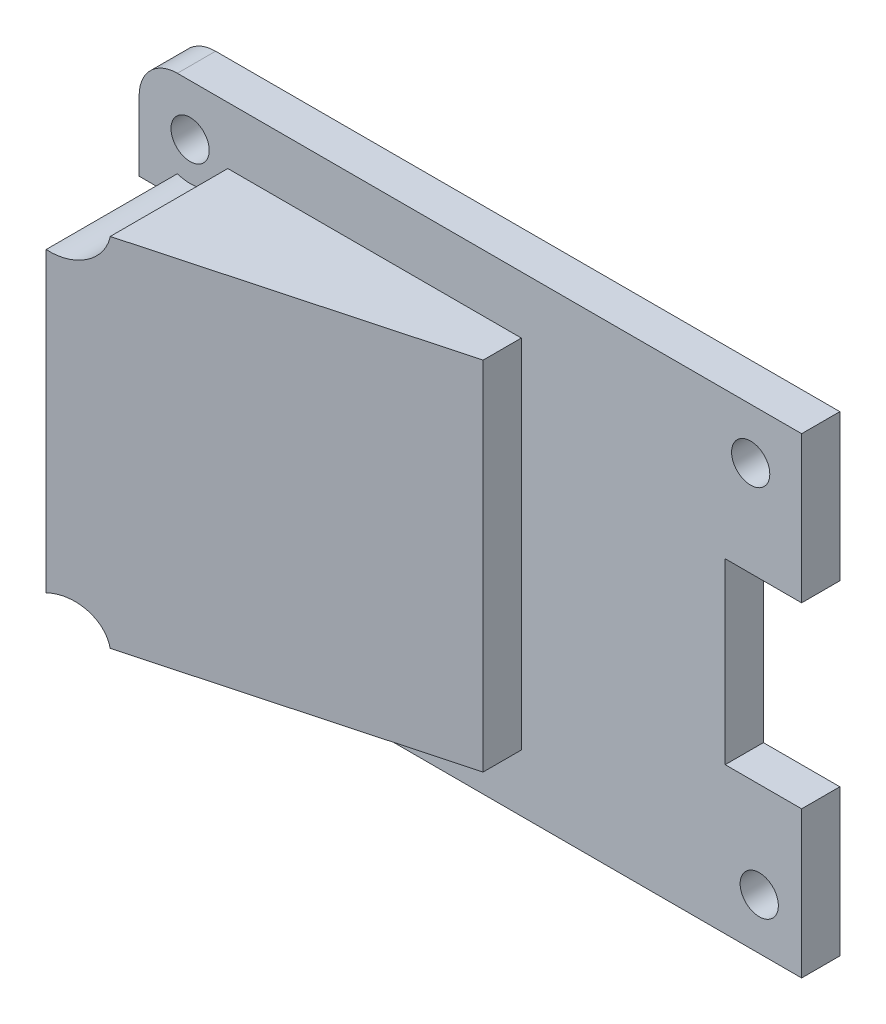
ISO-10303-21;
HEADER;
FILE_DESCRIPTION(('STEP AP214'),'2;1');
FILE_NAME('part.step','',(''),(''),'','','');
FILE_SCHEMA(('AUTOMOTIVE_DESIGN { 1 0 10303 214 1 1 1 1 }'));
ENDSEC;
DATA;
#1=APPLICATION_CONTEXT('core data for automotive mechanical design processes');
#2=APPLICATION_PROTOCOL_DEFINITION('international standard','automotive_design',2000,#1);
#3=PRODUCT_CONTEXT('',#1,'mechanical');
#4=PRODUCT('Part','Part','',(#3));
#5=PRODUCT_RELATED_PRODUCT_CATEGORY('part','',(#4));
#6=PRODUCT_DEFINITION_FORMATION('','',#4);
#7=PRODUCT_DEFINITION_CONTEXT('part definition',#1,'design');
#8=PRODUCT_DEFINITION('design','',#6,#7);
#9=PRODUCT_DEFINITION_SHAPE('','',#8);
#10=(LENGTH_UNIT() NAMED_UNIT(*) SI_UNIT(.MILLI.,.METRE.));
#11=(NAMED_UNIT(*) PLANE_ANGLE_UNIT() SI_UNIT($,.RADIAN.));
#12=(NAMED_UNIT(*) SI_UNIT($,.STERADIAN.) SOLID_ANGLE_UNIT());
#13=UNCERTAINTY_MEASURE_WITH_UNIT(LENGTH_MEASURE(1.E-05),#10,'distance_accuracy_value','');
#14=(GEOMETRIC_REPRESENTATION_CONTEXT(3) GLOBAL_UNCERTAINTY_ASSIGNED_CONTEXT((#13)) GLOBAL_UNIT_ASSIGNED_CONTEXT((#10,
#11,#12)) REPRESENTATION_CONTEXT('',''));
#15=CARTESIAN_POINT('',(0.,0.,0.));
#16=DIRECTION('',(0.,0.,1.));
#17=DIRECTION('',(1.,0.,0.));
#18=AXIS2_PLACEMENT_3D('',#15,#16,#17);
#19=CARTESIAN_POINT('',(-62.296803652968,20.7902218953109,22.3));
#20=DIRECTION('',(1.,0.,0.));
#21=DIRECTION('',(0.,0.,-1.));
#22=AXIS2_PLACEMENT_3D('',#19,#20,#21);
#23=PLANE('',#22);
#24=DIRECTION('',(0.,-1.,0.));
#25=VECTOR('',#24,1.);
#26=CARTESIAN_POINT('',(-62.296803652968,20.7902218953109,22.3));
#27=LINE('',#26,#25);
#28=CARTESIAN_POINT('',(-62.296803652968,18.4592441081305,22.3));
#29=VERTEX_POINT('',#28);
#30=CARTESIAN_POINT('',(-62.296803652968,-4.88390164237709,22.3));
#31=VERTEX_POINT('',#30);
#32=EDGE_CURVE('E43',#29,#31,#27,.T.);
#33=ORIENTED_EDGE('',*,*,#32,.F.);
#34=DIRECTION('',(0.,0.,-1.));
#35=VECTOR('',#34,1.);
#36=CARTESIAN_POINT('',(-62.296803652968,18.4592441081305,22.3));
#37=LINE('',#36,#35);
#38=CARTESIAN_POINT('',(-62.296803652968,18.4592441081305,12.));
#39=VERTEX_POINT('',#38);
#40=EDGE_CURVE('E227',#39,#29,#37,.F.);
#41=ORIENTED_EDGE('',*,*,#40,.F.);
#42=DIRECTION('',(0.,-1.,0.));
#43=VECTOR('',#42,1.);
#44=CARTESIAN_POINT('',(-62.296803652968,20.7902218953109,12.));
#45=LINE('',#44,#43);
#46=CARTESIAN_POINT('',(-62.296803652968,16.7876712328767,12.));
#47=VERTEX_POINT('',#46);
#48=EDGE_CURVE('E254',#39,#47,#45,.T.);
#49=ORIENTED_EDGE('',*,*,#48,.T.);
#50=CARTESIAN_POINT('',(-62.296803652968,-3.21232876712328,12.));
#51=VERTEX_POINT('',#50);
#52=EDGE_CURVE('E250',#47,#51,#45,.T.);
#53=ORIENTED_EDGE('',*,*,#52,.T.);
#54=CARTESIAN_POINT('',(-62.296803652968,-4.88390164237709,12.));
#55=VERTEX_POINT('',#54);
#56=EDGE_CURVE('E253',#51,#55,#45,.T.);
#57=ORIENTED_EDGE('',*,*,#56,.T.);
#58=DIRECTION('',(0.,0.,-1.));
#59=VECTOR('',#58,1.);
#60=CARTESIAN_POINT('',(-62.296803652968,-4.88390164237709,22.3));
#61=LINE('',#60,#59);
#62=EDGE_CURVE('E244',#31,#55,#61,.T.);
#63=ORIENTED_EDGE('',*,*,#62,.F.);
#64=EDGE_LOOP('',(#33,#41,#49,#53,#57,#63));
#65=FACE_BOUND('',#64,.T.);
#66=ADVANCED_FACE('F33',(#65),#23,.F.);
#67=CARTESIAN_POINT('',(-57.296803652968,20.7902218953109,12.));
#68=DIRECTION('',(0.,-1.,0.));
#69=DIRECTION('',(1.,0.,0.));
#70=AXIS2_PLACEMENT_3D('',#67,#68,#69);
#71=PLANE('',#70);
#72=DIRECTION('',(0.,0.,-1.));
#73=VECTOR('',#72,1.);
#74=CARTESIAN_POINT('',(-58.3383337517259,20.7902218953109,22.3));
#75=LINE('',#74,#73);
#76=CARTESIAN_POINT('',(-58.3383337517259,20.7902218953109,21.2297470267012));
#77=VERTEX_POINT('',#76);
#78=CARTESIAN_POINT('',(-58.3383337517259,20.7902218953109,12.));
#79=VERTEX_POINT('',#78);
#80=EDGE_CURVE('E237',#77,#79,#75,.T.);
#81=ORIENTED_EDGE('',*,*,#80,.F.);
#82=DIRECTION('',(0.965339050299695,0.,-0.26099907656251));
#83=VECTOR('',#82,1.);
#84=CARTESIAN_POINT('',(-35.296803652968,20.7902218953109,15.));
#85=LINE('',#84,#83);
#86=CARTESIAN_POINT('',(-35.296803652968,20.7902218953109,15.));
#87=VERTEX_POINT('',#86);
#88=EDGE_CURVE('E240',#77,#87,#85,.T.);
#89=ORIENTED_EDGE('',*,*,#88,.T.);
#90=DIRECTION('',(0.,0.,-1.));
#91=VECTOR('',#90,1.);
#92=CARTESIAN_POINT('',(-35.296803652968,20.7902218953109,12.));
#93=LINE('',#92,#91);
#94=CARTESIAN_POINT('',(-35.296803652968,20.7902218953109,12.));
#95=VERTEX_POINT('',#94);
#96=EDGE_CURVE('E392',#87,#95,#93,.T.);
#97=ORIENTED_EDGE('',*,*,#96,.T.);
#98=DIRECTION('',(-1.,0.,0.));
#99=VECTOR('',#98,1.);
#100=CARTESIAN_POINT('',(-57.296803652968,20.7902218953109,12.));
#101=LINE('',#100,#99);
#102=EDGE_CURVE('E255',#95,#79,#101,.T.);
#103=ORIENTED_EDGE('',*,*,#102,.T.);
#104=EDGE_LOOP('',(#81,#89,#97,#103));
#105=FACE_BOUND('',#104,.T.);
#106=ADVANCED_FACE('F548',(#105),#71,.F.);
#107=CARTESIAN_POINT('',(1.37485246306783,0.,5.08507075381252));
#108=DIRECTION('',(0.26099907656251,0.,0.965339050299695));
#109=DIRECTION('',(0.965339050299695,0.,-0.26099907656251));
#110=AXIS2_PLACEMENT_3D('',#107,#108,#109);
#111=PLANE('',#110);
#112=ORIENTED_EDGE('',*,*,#88,.F.);
#113=CARTESIAN_POINT('',(-61.296803652968,21.2876712328767,22.0296296296296));
#114=DIRECTION('',(0.26099907656251,0.,0.965339050299695));
#115=DIRECTION('',(0.965339050299695,0.,-0.26099907656251));
#116=AXIS2_PLACEMENT_3D('',#113,#114,#115);
#117=ELLIPSE('',#116,3.10771640188868,3.00000000000001);
#118=EDGE_CURVE('E230',#77,#29,#117,.F.);
#119=ORIENTED_EDGE('',*,*,#118,.T.);
#120=ORIENTED_EDGE('',*,*,#32,.T.);
#121=CARTESIAN_POINT('',(-61.296803652968,-7.71232876712328,22.0296296296296));
#122=DIRECTION('',(0.26099907656251,0.,0.965339050299695));
#123=DIRECTION('',(0.965339050299695,0.,-0.26099907656251));
#124=AXIS2_PLACEMENT_3D('',#121,#122,#123);
#125=ELLIPSE('',#124,3.10771640188868,3.);
#126=CARTESIAN_POINT('',(-58.3387637614182,-7.21232876712328,21.229863288581));
#127=VERTEX_POINT('',#126);
#128=EDGE_CURVE('E37',#127,#31,#125,.T.);
#129=ORIENTED_EDGE('',*,*,#128,.F.);
#130=DIRECTION('',(0.965339050299695,0.,-0.26099907656251));
#131=VECTOR('',#130,1.);
#132=CARTESIAN_POINT('',(-35.296803652968,-7.21232876712328,15.));
#133=LINE('',#132,#131);
#134=CARTESIAN_POINT('',(-35.296803652968,-7.21232876712328,15.));
#135=VERTEX_POINT('',#134);
#136=EDGE_CURVE('E11',#127,#135,#133,.T.);
#137=ORIENTED_EDGE('',*,*,#136,.T.);
#138=DIRECTION('',(0.,-1.,0.));
#139=VECTOR('',#138,1.);
#140=CARTESIAN_POINT('',(-35.296803652968,20.7902218953109,15.));
#141=LINE('',#140,#139);
#142=EDGE_CURVE('E248',#87,#135,#141,.T.);
#143=ORIENTED_EDGE('',*,*,#142,.F.);
#144=EDGE_LOOP('',(#112,#119,#120,#129,#137,#143));
#145=FACE_BOUND('',#144,.T.);
#146=ADVANCED_FACE('F35',(#145),#111,.T.);
#147=CARTESIAN_POINT('',(-61.296803652968,-7.71232876712328,22.3));
#148=DIRECTION('',(0.,0.,-1.));
#149=DIRECTION('',(-1.,0.,0.));
#150=AXIS2_PLACEMENT_3D('',#147,#148,#149);
#151=CYLINDRICAL_SURFACE('',#150,3.);
#152=DIRECTION('',(0.,0.,-1.));
#153=VECTOR('',#152,1.);
#154=CARTESIAN_POINT('',(-58.3387637614182,-7.21232876712328,22.3));
#155=LINE('',#154,#153);
#156=CARTESIAN_POINT('',(-58.3387637614182,-7.21232876712328,12.));
#157=VERTEX_POINT('',#156);
#158=EDGE_CURVE('E390',#157,#127,#155,.F.);
#159=ORIENTED_EDGE('',*,*,#158,.T.);
#160=ORIENTED_EDGE('',*,*,#128,.T.);
#161=ORIENTED_EDGE('',*,*,#62,.T.);
#162=CARTESIAN_POINT('',(-61.296803652968,-7.71232876712328,12.));
#163=DIRECTION('',(0.,0.,1.));
#164=DIRECTION('',(1.,0.,0.));
#165=AXIS2_PLACEMENT_3D('',#162,#163,#164);
#166=CIRCLE('',#165,3.);
#167=EDGE_CURVE('E258',#157,#55,#166,.T.);
#168=ORIENTED_EDGE('',*,*,#167,.F.);
#169=EDGE_LOOP('',(#159,#160,#161,#168));
#170=FACE_BOUND('',#169,.T.);
#171=ADVANCED_FACE('F617',(#170),#151,.F.);
#172=CARTESIAN_POINT('',(-61.296803652968,-7.71232876712328,0.));
#173=DIRECTION('',(0.,0.,1.));
#174=DIRECTION('',(1.,0.,0.));
#175=AXIS2_PLACEMENT_3D('',#172,#173,#174);
#176=CYLINDRICAL_SURFACE('',#175,1.5);
#177=CARTESIAN_POINT('',(-61.296803652968,-7.71232876712328,8.99999999999999));
#178=DIRECTION('',(0.,0.,1.));
#179=DIRECTION('',(1.,0.,0.));
#180=AXIS2_PLACEMENT_3D('',#177,#178,#179);
#181=CIRCLE('',#180,1.5);
#182=CARTESIAN_POINT('',(-59.796803652968,-7.71232876712328,8.99999999999999));
#183=VERTEX_POINT('',#182);
#184=EDGE_CURVE('E266',#183,#183,#181,.F.);
#185=ORIENTED_EDGE('',*,*,#184,.T.);
#186=EDGE_LOOP('',(#185));
#187=FACE_BOUND('',#186,.T.);
#188=CARTESIAN_POINT('',(-61.296803652968,-7.71232876712328,12.));
#189=DIRECTION('',(0.,0.,1.));
#190=DIRECTION('',(1.,0.,0.));
#191=AXIS2_PLACEMENT_3D('',#188,#189,#190);
#192=CIRCLE('',#191,1.5);
#193=CARTESIAN_POINT('',(-59.796803652968,-7.71232876712328,12.));
#194=VERTEX_POINT('',#193);
#195=EDGE_CURVE('E269',#194,#194,#192,.T.);
#196=ORIENTED_EDGE('',*,*,#195,.T.);
#197=EDGE_LOOP('',(#196));
#198=FACE_BOUND('',#197,.T.);
#199=ADVANCED_FACE('F575',(#187,#198),#176,.F.);
#200=CARTESIAN_POINT('',(-26.296803652968,-7.21232876712328,12.));
#201=DIRECTION('',(0.,1.,0.));
#202=DIRECTION('',(-1.,0.,0.));
#203=AXIS2_PLACEMENT_3D('',#200,#201,#202);
#204=PLANE('',#203);
#205=ORIENTED_EDGE('',*,*,#158,.F.);
#206=DIRECTION('',(1.,0.,0.));
#207=VECTOR('',#206,1.);
#208=CARTESIAN_POINT('',(-26.296803652968,-7.21232876712328,12.));
#209=LINE('',#208,#207);
#210=CARTESIAN_POINT('',(-35.296803652968,-7.21232876712328,12.));
#211=VERTEX_POINT('',#210);
#212=EDGE_CURVE('E265',#157,#211,#209,.T.);
#213=ORIENTED_EDGE('',*,*,#212,.T.);
#214=DIRECTION('',(0.,0.,-1.));
#215=VECTOR('',#214,1.);
#216=CARTESIAN_POINT('',(-35.296803652968,-7.21232876712328,15.));
#217=LINE('',#216,#215);
#218=EDGE_CURVE('E408',#135,#211,#217,.T.);
#219=ORIENTED_EDGE('',*,*,#218,.F.);
#220=ORIENTED_EDGE('',*,*,#136,.F.);
#221=EDGE_LOOP('',(#205,#213,#219,#220));
#222=FACE_BOUND('',#221,.T.);
#223=ADVANCED_FACE('F572',(#222),#204,.F.);
#224=CARTESIAN_POINT('',(-61.296803652968,21.2876712328767,0.));
#225=DIRECTION('',(0.,0.,1.));
#226=DIRECTION('',(1.,0.,0.));
#227=AXIS2_PLACEMENT_3D('',#224,#225,#226);
#228=CYLINDRICAL_SURFACE('',#227,1.5);
#229=CARTESIAN_POINT('',(-61.296803652968,21.2876712328767,8.99999999999999));
#230=DIRECTION('',(0.,0.,1.));
#231=DIRECTION('',(1.,0.,0.));
#232=AXIS2_PLACEMENT_3D('',#229,#230,#231);
#233=CIRCLE('',#232,1.5);
#234=CARTESIAN_POINT('',(-59.796803652968,21.2876712328767,8.99999999999999));
#235=VERTEX_POINT('',#234);
#236=EDGE_CURVE('E262',#235,#235,#233,.F.);
#237=ORIENTED_EDGE('',*,*,#236,.T.);
#238=EDGE_LOOP('',(#237));
#239=FACE_BOUND('',#238,.T.);
#240=CARTESIAN_POINT('',(-61.296803652968,21.2876712328767,12.));
#241=DIRECTION('',(0.,0.,1.));
#242=DIRECTION('',(1.,0.,0.));
#243=AXIS2_PLACEMENT_3D('',#240,#241,#242);
#244=CIRCLE('',#243,1.5);
#245=CARTESIAN_POINT('',(-59.796803652968,21.2876712328767,12.));
#246=VERTEX_POINT('',#245);
#247=EDGE_CURVE('E259',#246,#246,#244,.T.);
#248=ORIENTED_EDGE('',*,*,#247,.T.);
#249=EDGE_LOOP('',(#248));
#250=FACE_BOUND('',#249,.T.);
#251=ADVANCED_FACE('F574',(#239,#250),#228,.F.);
#252=CARTESIAN_POINT('',(-62.296803652968,22.2876712328767,12.));
#253=DIRECTION('',(0.,0.,-1.));
#254=DIRECTION('',(-1.,0.,0.));
#255=AXIS2_PLACEMENT_3D('',#252,#253,#254);
#256=PLANE('',#255);
#257=ORIENTED_EDGE('',*,*,#48,.F.);
#258=CARTESIAN_POINT('',(-61.296803652968,21.2876712328767,12.));
#259=DIRECTION('',(0.,0.,1.));
#260=DIRECTION('',(1.,0.,0.));
#261=AXIS2_PLACEMENT_3D('',#258,#259,#260);
#262=CIRCLE('',#261,3.);
#263=EDGE_CURVE('E233',#39,#79,#262,.T.);
#264=ORIENTED_EDGE('',*,*,#263,.T.);
#265=ORIENTED_EDGE('',*,*,#102,.F.);
#266=DIRECTION('',(0.,1.,0.));
#267=VECTOR('',#266,1.);
#268=CARTESIAN_POINT('',(-35.296803652968,20.7902218953109,12.));
#269=LINE('',#268,#267);
#270=EDGE_CURVE('E415',#211,#95,#269,.T.);
#271=ORIENTED_EDGE('',*,*,#270,.F.);
#272=ORIENTED_EDGE('',*,*,#212,.F.);
#273=ORIENTED_EDGE('',*,*,#167,.T.);
#274=ORIENTED_EDGE('',*,*,#56,.F.);
#275=DIRECTION('',(-1.,0.,0.));
#276=VECTOR('',#275,1.);
#277=CARTESIAN_POINT('',(-36.296803652968,-3.21232876712328,12.));
#278=LINE('',#277,#276);
#279=CARTESIAN_POINT('',(-65.296803652968,-3.21232876712328,12.));
#280=VERTEX_POINT('',#279);
#281=EDGE_CURVE('E394',#51,#280,#278,.T.);
#282=ORIENTED_EDGE('',*,*,#281,.T.);
#283=DIRECTION('',(0.,-1.,0.));
#284=VECTOR('',#283,1.);
#285=CARTESIAN_POINT('',(-65.296803652968,-3.21232876712328,12.));
#286=LINE('',#285,#284);
#287=CARTESIAN_POINT('',(-65.296803652968,-8.71232876712329,12.));
#288=VERTEX_POINT('',#287);
#289=EDGE_CURVE('E398',#280,#288,#286,.T.);
#290=ORIENTED_EDGE('',*,*,#289,.T.);
#291=CARTESIAN_POINT('',(-62.296803652968,-8.71232876712325,12.));
#292=DIRECTION('',(0.,0.,1.));
#293=DIRECTION('',(-1.,0.,0.));
#294=AXIS2_PLACEMENT_3D('',#291,#292,#293);
#295=CIRCLE('',#294,3.00000000000003);
#296=CARTESIAN_POINT('',(-62.296803652968,-11.7123287671233,12.));
#297=VERTEX_POINT('',#296);
#298=EDGE_CURVE('E404',#288,#297,#295,.T.);
#299=ORIENTED_EDGE('',*,*,#298,.T.);
#300=DIRECTION('',(1.,0.,0.));
#301=VECTOR('',#300,1.);
#302=CARTESIAN_POINT('',(-62.296803652968,-11.7123287671233,12.));
#303=LINE('',#302,#301);
#304=CARTESIAN_POINT('',(-13.296803652968,-11.7123287671233,12.));
#305=VERTEX_POINT('',#304);
#306=EDGE_CURVE('E447',#297,#305,#303,.T.);
#307=ORIENTED_EDGE('',*,*,#306,.T.);
#308=DIRECTION('',(0.,1.,0.));
#309=VECTOR('',#308,1.);
#310=CARTESIAN_POINT('',(-13.296803652968,-11.7123287671233,12.));
#311=LINE('',#310,#309);
#312=CARTESIAN_POINT('',(-13.296803652968,-0.212328767123283,12.));
#313=VERTEX_POINT('',#312);
#314=EDGE_CURVE('E444',#305,#313,#311,.T.);
#315=ORIENTED_EDGE('',*,*,#314,.T.);
#316=DIRECTION('',(-1.,0.,0.));
#317=VECTOR('',#316,1.);
#318=CARTESIAN_POINT('',(-13.296803652968,-0.212328767123283,12.));
#319=LINE('',#318,#317);
#320=CARTESIAN_POINT('',(-19.296803652968,-0.212328767123284,12.));
#321=VERTEX_POINT('',#320);
#322=EDGE_CURVE('E441',#313,#321,#319,.T.);
#323=ORIENTED_EDGE('',*,*,#322,.T.);
#324=DIRECTION('',(0.,1.,0.));
#325=VECTOR('',#324,1.);
#326=CARTESIAN_POINT('',(-19.296803652968,-0.212328767123284,12.));
#327=LINE('',#326,#325);
#328=CARTESIAN_POINT('',(-19.296803652968,13.7876712328767,12.));
#329=VERTEX_POINT('',#328);
#330=EDGE_CURVE('E438',#321,#329,#327,.T.);
#331=ORIENTED_EDGE('',*,*,#330,.T.);
#332=DIRECTION('',(1.,0.,0.));
#333=VECTOR('',#332,1.);
#334=CARTESIAN_POINT('',(-19.296803652968,13.7876712328767,12.));
#335=LINE('',#334,#333);
#336=CARTESIAN_POINT('',(-13.296803652968,13.7876712328767,12.));
#337=VERTEX_POINT('',#336);
#338=EDGE_CURVE('E435',#329,#337,#335,.T.);
#339=ORIENTED_EDGE('',*,*,#338,.T.);
#340=DIRECTION('',(0.,1.,0.));
#341=VECTOR('',#340,1.);
#342=CARTESIAN_POINT('',(-13.296803652968,13.7876712328767,12.));
#343=LINE('',#342,#341);
#344=CARTESIAN_POINT('',(-13.296803652968,25.2876712328767,12.));
#345=VERTEX_POINT('',#344);
#346=EDGE_CURVE('E432',#337,#345,#343,.T.);
#347=ORIENTED_EDGE('',*,*,#346,.T.);
#348=DIRECTION('',(-1.,0.,0.));
#349=VECTOR('',#348,1.);
#350=CARTESIAN_POINT('',(-13.296803652968,25.2876712328767,12.));
#351=LINE('',#350,#349);
#352=CARTESIAN_POINT('',(-62.296803652968,25.2876712328767,12.));
#353=VERTEX_POINT('',#352);
#354=EDGE_CURVE('E429',#345,#353,#351,.T.);
#355=ORIENTED_EDGE('',*,*,#354,.T.);
#356=CARTESIAN_POINT('',(-62.296803652968,22.2876712328767,12.));
#357=DIRECTION('',(0.,0.,1.));
#358=DIRECTION('',(-1.,0.,0.));
#359=AXIS2_PLACEMENT_3D('',#356,#357,#358);
#360=CIRCLE('',#359,2.99999999999998);
#361=CARTESIAN_POINT('',(-65.296803652968,22.2876712328767,12.));
#362=VERTEX_POINT('',#361);
#363=EDGE_CURVE('E426',#353,#362,#360,.T.);
#364=ORIENTED_EDGE('',*,*,#363,.T.);
#365=DIRECTION('',(0.,-1.,0.));
#366=VECTOR('',#365,1.);
#367=CARTESIAN_POINT('',(-65.296803652968,22.2876712328767,12.));
#368=LINE('',#367,#366);
#369=CARTESIAN_POINT('',(-65.296803652968,16.7876712328767,12.));
#370=VERTEX_POINT('',#369);
#371=EDGE_CURVE('E423',#362,#370,#368,.T.);
#372=ORIENTED_EDGE('',*,*,#371,.T.);
#373=DIRECTION('',(1.,0.,0.));
#374=VECTOR('',#373,1.);
#375=CARTESIAN_POINT('',(-65.296803652968,16.7876712328767,12.));
#376=LINE('',#375,#374);
#377=EDGE_CURVE('E388',#370,#47,#376,.T.);
#378=ORIENTED_EDGE('',*,*,#377,.T.);
#379=EDGE_LOOP('',(#257,#264,#265,#271,#272,#273,#274,#282,#290,#299,#307,#315,#323,#331,#339,
#347,#355,#364,#372,#378));
#380=FACE_BOUND('',#379,.T.);
#381=CARTESIAN_POINT('',(-17.296803652968,21.2876712328767,12.));
#382=DIRECTION('',(0.,0.,1.));
#383=DIRECTION('',(1.,0.,0.));
#384=AXIS2_PLACEMENT_3D('',#381,#382,#383);
#385=CIRCLE('',#384,1.5);
#386=CARTESIAN_POINT('',(-15.796803652968,21.2876712328767,12.));
#387=VERTEX_POINT('',#386);
#388=EDGE_CURVE('E277',#387,#387,#385,.T.);
#389=ORIENTED_EDGE('',*,*,#388,.F.);
#390=EDGE_LOOP('',(#389));
#391=FACE_BOUND('',#390,.T.);
#392=CARTESIAN_POINT('',(-16.6240723416581,-7.71232876712328,12.));
#393=DIRECTION('',(0.,0.,1.));
#394=DIRECTION('',(1.,0.,0.));
#395=AXIS2_PLACEMENT_3D('',#392,#393,#394);
#396=CIRCLE('',#395,1.5);
#397=CARTESIAN_POINT('',(-15.124072341658,-7.71232876712328,12.));
#398=VERTEX_POINT('',#397);
#399=EDGE_CURVE('E273',#398,#398,#396,.T.);
#400=ORIENTED_EDGE('',*,*,#399,.F.);
#401=EDGE_LOOP('',(#400));
#402=FACE_BOUND('',#401,.T.);
#403=ORIENTED_EDGE('',*,*,#195,.F.);
#404=EDGE_LOOP('',(#403));
#405=FACE_BOUND('',#404,.T.);
#406=ORIENTED_EDGE('',*,*,#247,.F.);
#407=EDGE_LOOP('',(#406));
#408=FACE_BOUND('',#407,.T.);
#409=ADVANCED_FACE('F500',(#380,#391,#402,#405,#408),#256,.F.);
#410=CARTESIAN_POINT('',(-16.6240723416581,-7.71232876712328,0.));
#411=DIRECTION('',(0.,0.,1.));
#412=DIRECTION('',(1.,0.,0.));
#413=AXIS2_PLACEMENT_3D('',#410,#411,#412);
#414=CYLINDRICAL_SURFACE('',#413,1.5);
#415=CARTESIAN_POINT('',(-16.6240723416581,-7.71232876712328,9.));
#416=DIRECTION('',(0.,0.,1.));
#417=DIRECTION('',(1.,0.,0.));
#418=AXIS2_PLACEMENT_3D('',#415,#416,#417);
#419=CIRCLE('',#418,1.5);
#420=CARTESIAN_POINT('',(-15.1240723416581,-7.71232876712328,9.));
#421=VERTEX_POINT('',#420);
#422=EDGE_CURVE('E270',#421,#421,#419,.F.);
#423=ORIENTED_EDGE('',*,*,#422,.T.);
#424=EDGE_LOOP('',(#423));
#425=FACE_BOUND('',#424,.T.);
#426=ORIENTED_EDGE('',*,*,#399,.T.);
#427=EDGE_LOOP('',(#426));
#428=FACE_BOUND('',#427,.T.);
#429=ADVANCED_FACE('F793',(#425,#428),#414,.F.);
#430=CARTESIAN_POINT('',(-17.296803652968,21.2876712328767,0.));
#431=DIRECTION('',(0.,0.,1.));
#432=DIRECTION('',(1.,0.,0.));
#433=AXIS2_PLACEMENT_3D('',#430,#431,#432);
#434=CYLINDRICAL_SURFACE('',#433,1.5);
#435=CARTESIAN_POINT('',(-17.296803652968,21.2876712328767,9.));
#436=DIRECTION('',(0.,0.,1.));
#437=DIRECTION('',(1.,0.,0.));
#438=AXIS2_PLACEMENT_3D('',#435,#436,#437);
#439=CIRCLE('',#438,1.5);
#440=CARTESIAN_POINT('',(-15.796803652968,21.2876712328767,9.));
#441=VERTEX_POINT('',#440);
#442=EDGE_CURVE('E274',#441,#441,#439,.F.);
#443=ORIENTED_EDGE('',*,*,#442,.T.);
#444=EDGE_LOOP('',(#443));
#445=FACE_BOUND('',#444,.T.);
#446=ORIENTED_EDGE('',*,*,#388,.T.);
#447=EDGE_LOOP('',(#446));
#448=FACE_BOUND('',#447,.T.);
#449=ADVANCED_FACE('F787',(#445,#448),#434,.F.);
#450=CARTESIAN_POINT('',(-65.296803652968,25.2876712328767,3.));
#451=DIRECTION('',(1.,0.,0.));
#452=DIRECTION('',(0.,0.,-1.));
#453=AXIS2_PLACEMENT_3D('',#450,#451,#452);
#454=PLANE('',#453);
#455=DIRECTION('',(0.,0.,-1.));
#456=VECTOR('',#455,1.);
#457=CARTESIAN_POINT('',(-65.296803652968,22.2876712328767,3.));
#458=LINE('',#457,#456);
#459=CARTESIAN_POINT('',(-65.296803652968,22.2876712328767,8.99999999999999));
#460=VERTEX_POINT('',#459);
#461=EDGE_CURVE('E299',#362,#460,#458,.T.);
#462=ORIENTED_EDGE('',*,*,#461,.T.);
#463=DIRECTION('',(0.,-1.,0.));
#464=VECTOR('',#463,1.);
#465=CARTESIAN_POINT('',(-65.296803652968,25.2876712328767,8.99999999999999));
#466=LINE('',#465,#464);
#467=CARTESIAN_POINT('',(-65.296803652968,16.7876712328767,8.99999999999999));
#468=VERTEX_POINT('',#467);
#469=EDGE_CURVE('E295',#460,#468,#466,.T.);
#470=ORIENTED_EDGE('',*,*,#469,.T.);
#471=DIRECTION('',(0.,0.,1.));
#472=VECTOR('',#471,1.);
#473=CARTESIAN_POINT('',(-65.296803652968,16.7876712328767,0.));
#474=LINE('',#473,#472);
#475=EDGE_CURVE('E298',#468,#370,#474,.T.);
#476=ORIENTED_EDGE('',*,*,#475,.T.);
#477=ORIENTED_EDGE('',*,*,#371,.F.);
#478=EDGE_LOOP('',(#462,#470,#476,#477));
#479=FACE_BOUND('',#478,.T.);
#480=ADVANCED_FACE('F537',(#479),#454,.F.);
#481=CARTESIAN_POINT('',(-62.296803652968,22.2876712328767,3.));
#482=DIRECTION('',(0.,0.,-1.));
#483=DIRECTION('',(-1.,0.,0.));
#484=AXIS2_PLACEMENT_3D('',#481,#482,#483);
#485=CYLINDRICAL_SURFACE('',#484,3.);
#486=CARTESIAN_POINT('',(-62.296803652968,22.2876712328767,8.99999999999999));
#487=DIRECTION('',(0.,0.,1.));
#488=DIRECTION('',(1.,0.,0.));
#489=AXIS2_PLACEMENT_3D('',#486,#487,#488);
#490=CIRCLE('',#489,3.);
#491=CARTESIAN_POINT('',(-62.296803652968,25.2876712328767,8.99999999999999));
#492=VERTEX_POINT('',#491);
#493=EDGE_CURVE('E291',#460,#492,#490,.F.);
#494=ORIENTED_EDGE('',*,*,#493,.F.);
#495=ORIENTED_EDGE('',*,*,#461,.F.);
#496=ORIENTED_EDGE('',*,*,#363,.F.);
#497=DIRECTION('',(0.,0.,-1.));
#498=VECTOR('',#497,1.);
#499=CARTESIAN_POINT('',(-62.296803652968,25.2876712328767,3.));
#500=LINE('',#499,#498);
#501=EDGE_CURVE('E282',#492,#353,#500,.F.);
#502=ORIENTED_EDGE('',*,*,#501,.F.);
#503=EDGE_LOOP('',(#494,#495,#496,#502));
#504=FACE_BOUND('',#503,.T.);
#505=ADVANCED_FACE('F535',(#504),#485,.T.);
#506=CARTESIAN_POINT('',(-65.296803652968,25.2876712328767,3.));
#507=DIRECTION('',(0.,-1.,0.));
#508=DIRECTION('',(0.,0.,-1.));
#509=AXIS2_PLACEMENT_3D('',#506,#507,#508);
#510=PLANE('',#509);
#511=DIRECTION('',(0.,0.,-1.));
#512=VECTOR('',#511,1.);
#513=CARTESIAN_POINT('',(-13.296803652968,25.2876712328767,3.));
#514=LINE('',#513,#512);
#515=CARTESIAN_POINT('',(-13.296803652968,25.2876712328767,9.));
#516=VERTEX_POINT('',#515);
#517=EDGE_CURVE('E323',#345,#516,#514,.T.);
#518=ORIENTED_EDGE('',*,*,#517,.T.);
#519=DIRECTION('',(-1.,0.,0.));
#520=VECTOR('',#519,1.);
#521=CARTESIAN_POINT('',(-13.296803652968,25.2876712328767,9.));
#522=LINE('',#521,#520);
#523=EDGE_CURVE('E320',#516,#492,#522,.T.);
#524=ORIENTED_EDGE('',*,*,#523,.T.);
#525=ORIENTED_EDGE('',*,*,#501,.T.);
#526=ORIENTED_EDGE('',*,*,#354,.F.);
#527=EDGE_LOOP('',(#518,#524,#525,#526));
#528=FACE_BOUND('',#527,.T.);
#529=ADVANCED_FACE('F529',(#528),#510,.F.);
#530=CARTESIAN_POINT('',(-13.296803652968,25.2876712328767,3.));
#531=DIRECTION('',(-1.,0.,0.));
#532=DIRECTION('',(0.,-1.,0.));
#533=AXIS2_PLACEMENT_3D('',#530,#531,#532);
#534=PLANE('',#533);
#535=DIRECTION('',(0.,0.,1.));
#536=VECTOR('',#535,1.);
#537=CARTESIAN_POINT('',(-13.296803652968,13.7876712328767,0.));
#538=LINE('',#537,#536);
#539=CARTESIAN_POINT('',(-13.296803652968,13.7876712328767,9.));
#540=VERTEX_POINT('',#539);
#541=EDGE_CURVE('E281',#540,#337,#538,.T.);
#542=ORIENTED_EDGE('',*,*,#541,.F.);
#543=DIRECTION('',(0.,-1.,0.));
#544=VECTOR('',#543,1.);
#545=CARTESIAN_POINT('',(-13.296803652968,25.2876712328767,9.));
#546=LINE('',#545,#544);
#547=EDGE_CURVE('E293',#516,#540,#546,.T.);
#548=ORIENTED_EDGE('',*,*,#547,.F.);
#549=ORIENTED_EDGE('',*,*,#517,.F.);
#550=ORIENTED_EDGE('',*,*,#346,.F.);
#551=EDGE_LOOP('',(#542,#548,#549,#550));
#552=FACE_BOUND('',#551,.T.);
#553=ADVANCED_FACE('F526',(#552),#534,.F.);
#554=CARTESIAN_POINT('',(-13.296803652968,13.7876712328767,0.));
#555=DIRECTION('',(0.,1.,0.));
#556=DIRECTION('',(-1.,0.,0.));
#557=AXIS2_PLACEMENT_3D('',#554,#555,#556);
#558=PLANE('',#557);
#559=DIRECTION('',(0.,0.,1.));
#560=VECTOR('',#559,1.);
#561=CARTESIAN_POINT('',(-19.296803652968,13.7876712328767,0.));
#562=LINE('',#561,#560);
#563=CARTESIAN_POINT('',(-19.296803652968,13.7876712328767,9.));
#564=VERTEX_POINT('',#563);
#565=EDGE_CURVE('E286',#564,#329,#562,.T.);
#566=ORIENTED_EDGE('',*,*,#565,.F.);
#567=DIRECTION('',(1.,0.,0.));
#568=VECTOR('',#567,1.);
#569=CARTESIAN_POINT('',(-13.296803652968,13.7876712328767,9.));
#570=LINE('',#569,#568);
#571=EDGE_CURVE('E278',#564,#540,#570,.T.);
#572=ORIENTED_EDGE('',*,*,#571,.T.);
#573=ORIENTED_EDGE('',*,*,#541,.T.);
#574=ORIENTED_EDGE('',*,*,#338,.F.);
#575=EDGE_LOOP('',(#566,#572,#573,#574));
#576=FACE_BOUND('',#575,.T.);
#577=ADVANCED_FACE('F521',(#576),#558,.F.);
#578=CARTESIAN_POINT('',(-19.296803652968,13.7876712328767,0.));
#579=DIRECTION('',(-1.,0.,0.));
#580=DIRECTION('',(0.,-1.,0.));
#581=AXIS2_PLACEMENT_3D('',#578,#579,#580);
#582=PLANE('',#581);
#583=DIRECTION('',(0.,0.,1.));
#584=VECTOR('',#583,1.);
#585=CARTESIAN_POINT('',(-19.296803652968,-0.212328767123284,0.));
#586=LINE('',#585,#584);
#587=CARTESIAN_POINT('',(-19.296803652968,-0.212328767123284,9.));
#588=VERTEX_POINT('',#587);
#589=EDGE_CURVE('E290',#588,#321,#586,.T.);
#590=ORIENTED_EDGE('',*,*,#589,.F.);
#591=DIRECTION('',(0.,1.,0.));
#592=VECTOR('',#591,1.);
#593=CARTESIAN_POINT('',(-19.296803652968,13.7876712328767,9.));
#594=LINE('',#593,#592);
#595=EDGE_CURVE('E283',#588,#564,#594,.T.);
#596=ORIENTED_EDGE('',*,*,#595,.T.);
#597=ORIENTED_EDGE('',*,*,#565,.T.);
#598=ORIENTED_EDGE('',*,*,#330,.F.);
#599=EDGE_LOOP('',(#590,#596,#597,#598));
#600=FACE_BOUND('',#599,.T.);
#601=ADVANCED_FACE('F518',(#600),#582,.F.);
#602=CARTESIAN_POINT('',(-13.296803652968,-0.212328767123283,0.));
#603=DIRECTION('',(0.,-1.,0.));
#604=DIRECTION('',(1.,0.,0.));
#605=AXIS2_PLACEMENT_3D('',#602,#603,#604);
#606=PLANE('',#605);
#607=DIRECTION('',(0.,0.,1.));
#608=VECTOR('',#607,1.);
#609=CARTESIAN_POINT('',(-13.296803652968,-0.212328767123283,0.));
#610=LINE('',#609,#608);
#611=CARTESIAN_POINT('',(-13.296803652968,-0.212328767123283,9.));
#612=VERTEX_POINT('',#611);
#613=EDGE_CURVE('E476',#612,#313,#610,.T.);
#614=ORIENTED_EDGE('',*,*,#613,.F.);
#615=DIRECTION('',(-1.,0.,0.));
#616=VECTOR('',#615,1.);
#617=CARTESIAN_POINT('',(-13.296803652968,-0.212328767123283,9.));
#618=LINE('',#617,#616);
#619=EDGE_CURVE('E287',#612,#588,#618,.T.);
#620=ORIENTED_EDGE('',*,*,#619,.T.);
#621=ORIENTED_EDGE('',*,*,#589,.T.);
#622=ORIENTED_EDGE('',*,*,#322,.F.);
#623=EDGE_LOOP('',(#614,#620,#621,#622));
#624=FACE_BOUND('',#623,.T.);
#625=ADVANCED_FACE('F745',(#624),#606,.F.);
#626=DIRECTION('',(0.,0.,-1.));
#627=VECTOR('',#626,1.);
#628=CARTESIAN_POINT('',(-13.296803652968,-11.7123287671233,3.));
#629=LINE('',#628,#627);
#630=CARTESIAN_POINT('',(-13.296803652968,-11.7123287671233,9.));
#631=VERTEX_POINT('',#630);
#632=EDGE_CURVE('E481',#305,#631,#629,.T.);
#633=ORIENTED_EDGE('',*,*,#632,.T.);
#634=EDGE_CURVE('E318',#612,#631,#546,.T.);
#635=ORIENTED_EDGE('',*,*,#634,.F.);
#636=ORIENTED_EDGE('',*,*,#613,.T.);
#637=ORIENTED_EDGE('',*,*,#314,.F.);
#638=EDGE_LOOP('',(#633,#635,#636,#637));
#639=FACE_BOUND('',#638,.T.);
#640=ADVANCED_FACE('F510',(#639),#534,.F.);
#641=CARTESIAN_POINT('',(-65.296803652968,-11.7123287671233,3.));
#642=DIRECTION('',(0.,1.,0.));
#643=DIRECTION('',(0.,0.,1.));
#644=AXIS2_PLACEMENT_3D('',#641,#642,#643);
#645=PLANE('',#644);
#646=DIRECTION('',(0.,0.,-1.));
#647=VECTOR('',#646,1.);
#648=CARTESIAN_POINT('',(-62.296803652968,-11.7123287671233,3.));
#649=LINE('',#648,#647);
#650=CARTESIAN_POINT('',(-62.296803652968,-11.7123287671233,8.99999999999999));
#651=VERTEX_POINT('',#650);
#652=EDGE_CURVE('E308',#297,#651,#649,.T.);
#653=ORIENTED_EDGE('',*,*,#652,.T.);
#654=DIRECTION('',(-1.,0.,0.));
#655=VECTOR('',#654,1.);
#656=CARTESIAN_POINT('',(-13.296803652968,-11.7123287671233,9.));
#657=LINE('',#656,#655);
#658=EDGE_CURVE('E303',#631,#651,#657,.T.);
#659=ORIENTED_EDGE('',*,*,#658,.F.);
#660=ORIENTED_EDGE('',*,*,#632,.F.);
#661=ORIENTED_EDGE('',*,*,#306,.F.);
#662=EDGE_LOOP('',(#653,#659,#660,#661));
#663=FACE_BOUND('',#662,.T.);
#664=ADVANCED_FACE('F506',(#663),#645,.F.);
#665=CARTESIAN_POINT('',(-62.296803652968,-8.71232876712328,3.));
#666=DIRECTION('',(0.,0.,-1.));
#667=DIRECTION('',(-1.,0.,0.));
#668=AXIS2_PLACEMENT_3D('',#665,#666,#667);
#669=CYLINDRICAL_SURFACE('',#668,3.);
#670=CARTESIAN_POINT('',(-62.296803652968,-8.71232876712328,8.99999999999999));
#671=DIRECTION('',(0.,0.,1.));
#672=DIRECTION('',(1.,0.,0.));
#673=AXIS2_PLACEMENT_3D('',#670,#671,#672);
#674=CIRCLE('',#673,3.);
#675=CARTESIAN_POINT('',(-65.296803652968,-8.71232876712329,8.99999999999999));
#676=VERTEX_POINT('',#675);
#677=EDGE_CURVE('E300',#651,#676,#674,.F.);
#678=ORIENTED_EDGE('',*,*,#677,.F.);
#679=ORIENTED_EDGE('',*,*,#652,.F.);
#680=ORIENTED_EDGE('',*,*,#298,.F.);
#681=DIRECTION('',(0.,0.,-1.));
#682=VECTOR('',#681,1.);
#683=CARTESIAN_POINT('',(-65.296803652968,-8.71232876712329,3.));
#684=LINE('',#683,#682);
#685=EDGE_CURVE('E307',#676,#288,#684,.F.);
#686=ORIENTED_EDGE('',*,*,#685,.F.);
#687=EDGE_LOOP('',(#678,#679,#680,#686));
#688=FACE_BOUND('',#687,.T.);
#689=ADVANCED_FACE('F725',(#688),#669,.T.);
#690=DIRECTION('',(0.,0.,1.));
#691=VECTOR('',#690,1.);
#692=CARTESIAN_POINT('',(-65.296803652968,-3.21232876712328,0.));
#693=LINE('',#692,#691);
#694=CARTESIAN_POINT('',(-65.296803652968,-3.21232876712328,8.99999999999999));
#695=VERTEX_POINT('',#694);
#696=EDGE_CURVE('E311',#695,#280,#693,.T.);
#697=ORIENTED_EDGE('',*,*,#696,.F.);
#698=DIRECTION('',(0.,-1.,0.));
#699=VECTOR('',#698,1.);
#700=CARTESIAN_POINT('',(-65.296803652968,25.2876712328767,8.99999999999999));
#701=LINE('',#700,#699);
#702=EDGE_CURVE('E304',#695,#676,#701,.T.);
#703=ORIENTED_EDGE('',*,*,#702,.T.);
#704=ORIENTED_EDGE('',*,*,#685,.T.);
#705=ORIENTED_EDGE('',*,*,#289,.F.);
#706=EDGE_LOOP('',(#697,#703,#704,#705));
#707=FACE_BOUND('',#706,.T.);
#708=ADVANCED_FACE('F717',(#707),#454,.F.);
#709=CARTESIAN_POINT('',(-65.296803652968,-3.21232876712328,0.));
#710=DIRECTION('',(0.,-1.,0.));
#711=DIRECTION('',(0.,0.,-1.));
#712=AXIS2_PLACEMENT_3D('',#709,#710,#711);
#713=PLANE('',#712);
#714=DIRECTION('',(1.,0.,0.));
#715=VECTOR('',#714,1.);
#716=CARTESIAN_POINT('',(-55.296803652968,-3.21232876712328,11.));
#717=LINE('',#716,#715);
#718=CARTESIAN_POINT('',(-55.296803652968,-3.21232876712328,11.));
#719=VERTEX_POINT('',#718);
#720=CARTESIAN_POINT('',(-36.296803652968,-3.21232876712328,11.));
#721=VERTEX_POINT('',#720);
#722=EDGE_CURVE('E381',#719,#721,#717,.T.);
#723=ORIENTED_EDGE('',*,*,#722,.F.);
#724=DIRECTION('',(0.,0.,-1.));
#725=VECTOR('',#724,1.);
#726=CARTESIAN_POINT('',(-55.296803652968,-3.21232876712328,11.));
#727=LINE('',#726,#725);
#728=CARTESIAN_POINT('',(-55.296803652968,-3.21232876712328,8.99999999999999));
#729=VERTEX_POINT('',#728);
#730=EDGE_CURVE('E312',#719,#729,#727,.T.);
#731=ORIENTED_EDGE('',*,*,#730,.T.);
#732=DIRECTION('',(-1.,0.,0.));
#733=VECTOR('',#732,1.);
#734=CARTESIAN_POINT('',(-65.296803652968,-3.21232876712328,8.99999999999999));
#735=LINE('',#734,#733);
#736=EDGE_CURVE('E309',#729,#695,#735,.T.);
#737=ORIENTED_EDGE('',*,*,#736,.T.);
#738=ORIENTED_EDGE('',*,*,#696,.T.);
#739=ORIENTED_EDGE('',*,*,#281,.F.);
#740=CARTESIAN_POINT('',(-36.296803652968,-3.21232876712328,12.));
#741=VERTEX_POINT('',#740);
#742=EDGE_CURVE('E400',#741,#51,#278,.T.);
#743=ORIENTED_EDGE('',*,*,#742,.F.);
#744=DIRECTION('',(0.,0.,1.));
#745=VECTOR('',#744,1.);
#746=CARTESIAN_POINT('',(-36.296803652968,-3.21232876712328,0.));
#747=LINE('',#746,#745);
#748=EDGE_CURVE('E472',#721,#741,#747,.T.);
#749=ORIENTED_EDGE('',*,*,#748,.F.);
#750=EDGE_LOOP('',(#723,#731,#737,#738,#739,#743,#749));
#751=FACE_BOUND('',#750,.T.);
#752=ADVANCED_FACE('F709',(#751),#713,.F.);
#753=CARTESIAN_POINT('',(-36.296803652968,16.7876712328767,0.));
#754=DIRECTION('',(1.,0.,0.));
#755=DIRECTION('',(0.,0.,-1.));
#756=AXIS2_PLACEMENT_3D('',#753,#754,#755);
#757=PLANE('',#756);
#758=DIRECTION('',(0.,0.,1.));
#759=VECTOR('',#758,1.);
#760=CARTESIAN_POINT('',(-36.296803652968,16.7876712328767,0.));
#761=LINE('',#760,#759);
#762=CARTESIAN_POINT('',(-36.296803652968,16.7876712328767,9.));
#763=VERTEX_POINT('',#762);
#764=CARTESIAN_POINT('',(-36.296803652968,16.7876712328767,11.));
#765=VERTEX_POINT('',#764);
#766=EDGE_CURVE('E338',#763,#765,#761,.T.);
#767=ORIENTED_EDGE('',*,*,#766,.F.);
#768=DIRECTION('',(0.,-1.,0.));
#769=VECTOR('',#768,1.);
#770=CARTESIAN_POINT('',(-36.296803652968,16.7876712328767,9.));
#771=LINE('',#770,#769);
#772=CARTESIAN_POINT('',(-36.296803652968,-3.21232876712328,9.));
#773=VERTEX_POINT('',#772);
#774=EDGE_CURVE('E313',#763,#773,#771,.T.);
#775=ORIENTED_EDGE('',*,*,#774,.T.);
#776=EDGE_CURVE('E316',#773,#721,#747,.T.);
#777=ORIENTED_EDGE('',*,*,#776,.T.);
#778=ORIENTED_EDGE('',*,*,#748,.T.);
#779=DIRECTION('',(0.,-1.,0.));
#780=VECTOR('',#779,1.);
#781=CARTESIAN_POINT('',(-36.296803652968,16.7876712328767,12.));
#782=LINE('',#781,#780);
#783=CARTESIAN_POINT('',(-36.296803652968,16.7876712328767,12.));
#784=VERTEX_POINT('',#783);
#785=EDGE_CURVE('E409',#784,#741,#782,.T.);
#786=ORIENTED_EDGE('',*,*,#785,.F.);
#787=EDGE_CURVE('E419',#765,#784,#761,.T.);
#788=ORIENTED_EDGE('',*,*,#787,.F.);
#789=EDGE_LOOP('',(#767,#775,#777,#778,#786,#788));
#790=FACE_BOUND('',#789,.T.);
#791=ADVANCED_FACE('F702',(#790),#757,.F.);
#792=CARTESIAN_POINT('',(-65.296803652968,16.7876712328767,0.));
#793=DIRECTION('',(0.,1.,0.));
#794=DIRECTION('',(-1.,0.,0.));
#795=AXIS2_PLACEMENT_3D('',#792,#793,#794);
#796=PLANE('',#795);
#797=DIRECTION('',(1.,0.,0.));
#798=VECTOR('',#797,1.);
#799=CARTESIAN_POINT('',(-65.296803652968,16.7876712328767,8.99999999999999));
#800=LINE('',#799,#798);
#801=CARTESIAN_POINT('',(-55.296803652968,16.7876712328767,8.99999999999999));
#802=VERTEX_POINT('',#801);
#803=EDGE_CURVE('E469',#468,#802,#800,.T.);
#804=ORIENTED_EDGE('',*,*,#803,.T.);
#805=DIRECTION('',(0.,0.,-1.));
#806=VECTOR('',#805,1.);
#807=CARTESIAN_POINT('',(-55.296803652968,16.7876712328767,11.));
#808=LINE('',#807,#806);
#809=CARTESIAN_POINT('',(-55.296803652968,16.7876712328767,11.));
#810=VERTEX_POINT('',#809);
#811=EDGE_CURVE('E334',#810,#802,#808,.T.);
#812=ORIENTED_EDGE('',*,*,#811,.F.);
#813=DIRECTION('',(-1.,0.,0.));
#814=VECTOR('',#813,1.);
#815=CARTESIAN_POINT('',(-55.296803652968,16.7876712328767,11.));
#816=LINE('',#815,#814);
#817=EDGE_CURVE('E347',#765,#810,#816,.T.);
#818=ORIENTED_EDGE('',*,*,#817,.F.);
#819=ORIENTED_EDGE('',*,*,#787,.T.);
#820=EDGE_CURVE('E416',#47,#784,#376,.T.);
#821=ORIENTED_EDGE('',*,*,#820,.F.);
#822=ORIENTED_EDGE('',*,*,#377,.F.);
#823=ORIENTED_EDGE('',*,*,#475,.F.);
#824=EDGE_LOOP('',(#804,#812,#818,#819,#821,#822,#823));
#825=FACE_BOUND('',#824,.T.);
#826=ADVANCED_FACE('F542',(#825),#796,.F.);
#827=CARTESIAN_POINT('',(0.,0.,12.));
#828=DIRECTION('',(0.,0.,-1.));
#829=DIRECTION('',(-1.,0.,0.));
#830=AXIS2_PLACEMENT_3D('',#827,#828,#829);
#831=PLANE('',#830);
#832=ORIENTED_EDGE('',*,*,#52,.F.);
#833=ORIENTED_EDGE('',*,*,#820,.T.);
#834=ORIENTED_EDGE('',*,*,#785,.T.);
#835=ORIENTED_EDGE('',*,*,#742,.T.);
#836=EDGE_LOOP('',(#832,#833,#834,#835));
#837=FACE_BOUND('',#836,.T.);
#838=ADVANCED_FACE('F545',(#837),#831,.T.);
#839=CARTESIAN_POINT('',(-35.296803652968,20.7902218953109,15.));
#840=DIRECTION('',(-1.,0.,0.));
#841=DIRECTION('',(0.,-1.,0.));
#842=AXIS2_PLACEMENT_3D('',#839,#840,#841);
#843=PLANE('',#842);
#844=ORIENTED_EDGE('',*,*,#218,.T.);
#845=ORIENTED_EDGE('',*,*,#270,.T.);
#846=ORIENTED_EDGE('',*,*,#96,.F.);
#847=ORIENTED_EDGE('',*,*,#142,.T.);
#848=EDGE_LOOP('',(#844,#845,#846,#847));
#849=FACE_BOUND('',#848,.T.);
#850=ADVANCED_FACE('F549',(#849),#843,.F.);
#851=CARTESIAN_POINT('',(-13.296803652968,25.2876712328767,9.));
#852=DIRECTION('',(0.,0.,1.));
#853=DIRECTION('',(1.,0.,0.));
#854=AXIS2_PLACEMENT_3D('',#851,#852,#853);
#855=PLANE('',#854);
#856=ORIENTED_EDGE('',*,*,#184,.F.);
#857=EDGE_LOOP('',(#856));
#858=FACE_BOUND('',#857,.T.);
#859=ORIENTED_EDGE('',*,*,#442,.F.);
#860=EDGE_LOOP('',(#859));
#861=FACE_BOUND('',#860,.T.);
#862=ORIENTED_EDGE('',*,*,#736,.F.);
#863=DIRECTION('',(0.,1.,0.));
#864=VECTOR('',#863,1.);
#865=CARTESIAN_POINT('',(-55.296803652968,-3.21232876712328,8.99999999999999));
#866=LINE('',#865,#864);
#867=CARTESIAN_POINT('',(-55.296803652968,-7.71232876712328,8.99999999999999));
#868=VERTEX_POINT('',#867);
#869=EDGE_CURVE('E368',#868,#729,#866,.T.);
#870=ORIENTED_EDGE('',*,*,#869,.F.);
#871=DIRECTION('',(-1.,0.,0.));
#872=VECTOR('',#871,1.);
#873=CARTESIAN_POINT('',(-55.296803652968,-7.71232876712328,8.99999999999999));
#874=LINE('',#873,#872);
#875=CARTESIAN_POINT('',(-35.296803652968,-7.71232876712329,9.));
#876=VERTEX_POINT('',#875);
#877=EDGE_CURVE('E365',#876,#868,#874,.T.);
#878=ORIENTED_EDGE('',*,*,#877,.F.);
#879=DIRECTION('',(0.,-1.,0.));
#880=VECTOR('',#879,1.);
#881=CARTESIAN_POINT('',(-35.296803652968,-3.21232876712328,9.));
#882=LINE('',#881,#880);
#883=CARTESIAN_POINT('',(-35.296803652968,-3.21232876712328,9.));
#884=VERTEX_POINT('',#883);
#885=EDGE_CURVE('E362',#884,#876,#882,.T.);
#886=ORIENTED_EDGE('',*,*,#885,.F.);
#887=DIRECTION('',(-1.,0.,0.));
#888=VECTOR('',#887,1.);
#889=CARTESIAN_POINT('',(-13.296803652968,-3.21232876712329,9.));
#890=LINE('',#889,#888);
#891=EDGE_CURVE('E294',#884,#773,#890,.T.);
#892=ORIENTED_EDGE('',*,*,#891,.T.);
#893=ORIENTED_EDGE('',*,*,#774,.F.);
#894=DIRECTION('',(-1.,0.,0.));
#895=VECTOR('',#894,1.);
#896=CARTESIAN_POINT('',(-55.296803652968,16.7876712328767,8.99999999999999));
#897=LINE('',#896,#895);
#898=CARTESIAN_POINT('',(-35.296803652968,16.7876712328767,9.));
#899=VERTEX_POINT('',#898);
#900=EDGE_CURVE('E333',#899,#763,#897,.T.);
#901=ORIENTED_EDGE('',*,*,#900,.F.);
#902=DIRECTION('',(0.,-1.,0.));
#903=VECTOR('',#902,1.);
#904=CARTESIAN_POINT('',(-35.296803652968,16.7876712328767,9.));
#905=LINE('',#904,#903);
#906=CARTESIAN_POINT('',(-35.296803652968,21.2876712328767,9.));
#907=VERTEX_POINT('',#906);
#908=EDGE_CURVE('E331',#907,#899,#905,.T.);
#909=ORIENTED_EDGE('',*,*,#908,.F.);
#910=DIRECTION('',(1.,0.,0.));
#911=VECTOR('',#910,1.);
#912=CARTESIAN_POINT('',(-55.296803652968,21.2876712328767,8.99999999999999));
#913=LINE('',#912,#911);
#914=CARTESIAN_POINT('',(-55.296803652968,21.2876712328767,8.99999999999999));
#915=VERTEX_POINT('',#914);
#916=EDGE_CURVE('E328',#915,#907,#913,.T.);
#917=ORIENTED_EDGE('',*,*,#916,.F.);
#918=DIRECTION('',(0.,1.,0.));
#919=VECTOR('',#918,1.);
#920=CARTESIAN_POINT('',(-55.296803652968,16.7876712328767,8.99999999999999));
#921=LINE('',#920,#919);
#922=EDGE_CURVE('E336',#802,#915,#921,.T.);
#923=ORIENTED_EDGE('',*,*,#922,.F.);
#924=ORIENTED_EDGE('',*,*,#803,.F.);
#925=ORIENTED_EDGE('',*,*,#469,.F.);
#926=ORIENTED_EDGE('',*,*,#493,.T.);
#927=ORIENTED_EDGE('',*,*,#523,.F.);
#928=ORIENTED_EDGE('',*,*,#547,.T.);
#929=ORIENTED_EDGE('',*,*,#571,.F.);
#930=ORIENTED_EDGE('',*,*,#595,.F.);
#931=ORIENTED_EDGE('',*,*,#619,.F.);
#932=ORIENTED_EDGE('',*,*,#634,.T.);
#933=ORIENTED_EDGE('',*,*,#658,.T.);
#934=ORIENTED_EDGE('',*,*,#677,.T.);
#935=ORIENTED_EDGE('',*,*,#702,.F.);
#936=EDGE_LOOP('',(#862,#870,#878,#886,#892,#893,#901,#909,#917,#923,#924,#925,#926,#927,#928,
#929,#930,#931,#932,#933,#934,#935));
#937=FACE_BOUND('',#936,.T.);
#938=ORIENTED_EDGE('',*,*,#422,.F.);
#939=EDGE_LOOP('',(#938));
#940=FACE_BOUND('',#939,.T.);
#941=ORIENTED_EDGE('',*,*,#236,.F.);
#942=EDGE_LOOP('',(#941));
#943=FACE_BOUND('',#942,.T.);
#944=ADVANCED_FACE('F551',(#858,#861,#937,#940,#943),#855,.F.);
#945=CARTESIAN_POINT('',(-55.296803652968,16.7876712328767,11.));
#946=DIRECTION('',(0.,-1.,0.));
#947=DIRECTION('',(1.,0.,0.));
#948=AXIS2_PLACEMENT_3D('',#945,#946,#947);
#949=PLANE('',#948);
#950=CARTESIAN_POINT('',(-35.296803652968,16.7876712328767,11.));
#951=VERTEX_POINT('',#950);
#952=EDGE_CURVE('E344',#951,#765,#816,.T.);
#953=ORIENTED_EDGE('',*,*,#952,.F.);
#954=DIRECTION('',(0.,0.,-1.));
#955=VECTOR('',#954,1.);
#956=CARTESIAN_POINT('',(-35.296803652968,16.7876712328767,11.));
#957=LINE('',#956,#955);
#958=EDGE_CURVE('E302',#951,#899,#957,.T.);
#959=ORIENTED_EDGE('',*,*,#958,.T.);
#960=ORIENTED_EDGE('',*,*,#900,.T.);
#961=ORIENTED_EDGE('',*,*,#766,.T.);
#962=EDGE_LOOP('',(#953,#959,#960,#961));
#963=FACE_BOUND('',#962,.T.);
#964=ADVANCED_FACE('F558',(#963),#949,.F.);
#965=CARTESIAN_POINT('',(-55.296803652968,16.7876712328767,11.));
#966=DIRECTION('',(-1.,0.,0.));
#967=DIRECTION('',(0.,0.,1.));
#968=AXIS2_PLACEMENT_3D('',#965,#966,#967);
#969=PLANE('',#968);
#970=ORIENTED_EDGE('',*,*,#922,.T.);
#971=DIRECTION('',(0.,0.,-1.));
#972=VECTOR('',#971,1.);
#973=CARTESIAN_POINT('',(-55.296803652968,21.2876712328767,11.));
#974=LINE('',#973,#972);
#975=CARTESIAN_POINT('',(-55.296803652968,21.2876712328767,11.));
#976=VERTEX_POINT('',#975);
#977=EDGE_CURVE('E324',#976,#915,#974,.T.);
#978=ORIENTED_EDGE('',*,*,#977,.F.);
#979=DIRECTION('',(0.,1.,0.));
#980=VECTOR('',#979,1.);
#981=CARTESIAN_POINT('',(-55.296803652968,16.7876712328767,11.));
#982=LINE('',#981,#980);
#983=EDGE_CURVE('E327',#810,#976,#982,.T.);
#984=ORIENTED_EDGE('',*,*,#983,.F.);
#985=ORIENTED_EDGE('',*,*,#811,.T.);
#986=EDGE_LOOP('',(#970,#978,#984,#985));
#987=FACE_BOUND('',#986,.T.);
#988=ADVANCED_FACE('F578',(#987),#969,.F.);
#989=CARTESIAN_POINT('',(-35.296803652968,16.7876712328767,11.));
#990=DIRECTION('',(1.,0.,0.));
#991=DIRECTION('',(0.,0.,-1.));
#992=AXIS2_PLACEMENT_3D('',#989,#990,#991);
#993=PLANE('',#992);
#994=ORIENTED_EDGE('',*,*,#908,.T.);
#995=ORIENTED_EDGE('',*,*,#958,.F.);
#996=DIRECTION('',(0.,-1.,0.));
#997=VECTOR('',#996,1.);
#998=CARTESIAN_POINT('',(-35.296803652968,16.7876712328767,11.));
#999=LINE('',#998,#997);
#1000=CARTESIAN_POINT('',(-35.296803652968,21.2876712328767,11.));
#1001=VERTEX_POINT('',#1000);
#1002=EDGE_CURVE('E348',#1001,#951,#999,.T.);
#1003=ORIENTED_EDGE('',*,*,#1002,.F.);
#1004=DIRECTION('',(0.,0.,-1.));
#1005=VECTOR('',#1004,1.);
#1006=CARTESIAN_POINT('',(-35.296803652968,21.2876712328767,11.));
#1007=LINE('',#1006,#1005);
#1008=EDGE_CURVE('E329',#1001,#907,#1007,.T.);
#1009=ORIENTED_EDGE('',*,*,#1008,.T.);
#1010=EDGE_LOOP('',(#994,#995,#1003,#1009));
#1011=FACE_BOUND('',#1010,.T.);
#1012=ADVANCED_FACE('F581',(#1011),#993,.F.);
#1013=CARTESIAN_POINT('',(-55.296803652968,21.2876712328767,11.));
#1014=DIRECTION('',(0.,1.,0.));
#1015=DIRECTION('',(-1.,0.,0.));
#1016=AXIS2_PLACEMENT_3D('',#1013,#1014,#1015);
#1017=PLANE('',#1016);
#1018=ORIENTED_EDGE('',*,*,#916,.T.);
#1019=ORIENTED_EDGE('',*,*,#1008,.F.);
#1020=DIRECTION('',(1.,0.,0.));
#1021=VECTOR('',#1020,1.);
#1022=CARTESIAN_POINT('',(-55.296803652968,21.2876712328767,11.));
#1023=LINE('',#1022,#1021);
#1024=EDGE_CURVE('E351',#976,#1001,#1023,.T.);
#1025=ORIENTED_EDGE('',*,*,#1024,.F.);
#1026=ORIENTED_EDGE('',*,*,#977,.T.);
#1027=EDGE_LOOP('',(#1018,#1019,#1025,#1026));
#1028=FACE_BOUND('',#1027,.T.);
#1029=ADVANCED_FACE('F583',(#1028),#1017,.F.);
#1030=CARTESIAN_POINT('',(0.,0.,11.));
#1031=DIRECTION('',(0.,0.,-1.));
#1032=DIRECTION('',(-1.,0.,0.));
#1033=AXIS2_PLACEMENT_3D('',#1030,#1031,#1032);
#1034=PLANE('',#1033);
#1035=ORIENTED_EDGE('',*,*,#983,.T.);
#1036=ORIENTED_EDGE('',*,*,#1024,.T.);
#1037=ORIENTED_EDGE('',*,*,#1002,.T.);
#1038=ORIENTED_EDGE('',*,*,#952,.T.);
#1039=ORIENTED_EDGE('',*,*,#817,.T.);
#1040=EDGE_LOOP('',(#1035,#1036,#1037,#1038,#1039));
#1041=FACE_BOUND('',#1040,.T.);
#1042=ADVANCED_FACE('F586',(#1041),#1034,.T.);
#1043=CARTESIAN_POINT('',(-55.296803652968,-3.21232876712328,11.));
#1044=DIRECTION('',(0.,1.,0.));
#1045=DIRECTION('',(-1.,0.,0.));
#1046=AXIS2_PLACEMENT_3D('',#1043,#1044,#1045);
#1047=PLANE('',#1046);
#1048=ORIENTED_EDGE('',*,*,#891,.F.);
#1049=DIRECTION('',(0.,0.,-1.));
#1050=VECTOR('',#1049,1.);
#1051=CARTESIAN_POINT('',(-35.296803652968,-3.21232876712328,11.));
#1052=LINE('',#1051,#1050);
#1053=CARTESIAN_POINT('',(-35.296803652968,-3.21232876712328,11.));
#1054=VERTEX_POINT('',#1053);
#1055=EDGE_CURVE('E358',#1054,#884,#1052,.T.);
#1056=ORIENTED_EDGE('',*,*,#1055,.F.);
#1057=EDGE_CURVE('E380',#721,#1054,#717,.T.);
#1058=ORIENTED_EDGE('',*,*,#1057,.F.);
#1059=ORIENTED_EDGE('',*,*,#776,.F.);
#1060=EDGE_LOOP('',(#1048,#1056,#1058,#1059));
#1061=FACE_BOUND('',#1060,.T.);
#1062=ADVANCED_FACE('F596',(#1061),#1047,.F.);
#1063=CARTESIAN_POINT('',(-55.296803652968,-3.21232876712328,11.));
#1064=DIRECTION('',(-1.,0.,0.));
#1065=DIRECTION('',(0.,0.,1.));
#1066=AXIS2_PLACEMENT_3D('',#1063,#1064,#1065);
#1067=PLANE('',#1066);
#1068=ORIENTED_EDGE('',*,*,#869,.T.);
#1069=ORIENTED_EDGE('',*,*,#730,.F.);
#1070=DIRECTION('',(0.,1.,0.));
#1071=VECTOR('',#1070,1.);
#1072=CARTESIAN_POINT('',(-55.296803652968,-3.21232876712328,11.));
#1073=LINE('',#1072,#1071);
#1074=CARTESIAN_POINT('',(-55.296803652968,-7.71232876712328,11.));
#1075=VERTEX_POINT('',#1074);
#1076=EDGE_CURVE('E361',#1075,#719,#1073,.T.);
#1077=ORIENTED_EDGE('',*,*,#1076,.F.);
#1078=DIRECTION('',(0.,0.,-1.));
#1079=VECTOR('',#1078,1.);
#1080=CARTESIAN_POINT('',(-55.296803652968,-7.71232876712328,11.));
#1081=LINE('',#1080,#1079);
#1082=EDGE_CURVE('E366',#1075,#868,#1081,.T.);
#1083=ORIENTED_EDGE('',*,*,#1082,.T.);
#1084=EDGE_LOOP('',(#1068,#1069,#1077,#1083));
#1085=FACE_BOUND('',#1084,.T.);
#1086=ADVANCED_FACE('F598',(#1085),#1067,.F.);
#1087=CARTESIAN_POINT('',(-55.296803652968,-7.71232876712328,11.));
#1088=DIRECTION('',(0.,-1.,0.));
#1089=DIRECTION('',(1.,0.,0.));
#1090=AXIS2_PLACEMENT_3D('',#1087,#1088,#1089);
#1091=PLANE('',#1090);
#1092=ORIENTED_EDGE('',*,*,#877,.T.);
#1093=ORIENTED_EDGE('',*,*,#1082,.F.);
#1094=DIRECTION('',(-1.,0.,0.));
#1095=VECTOR('',#1094,1.);
#1096=CARTESIAN_POINT('',(-55.296803652968,-7.71232876712328,11.));
#1097=LINE('',#1096,#1095);
#1098=CARTESIAN_POINT('',(-35.296803652968,-7.71232876712329,11.));
#1099=VERTEX_POINT('',#1098);
#1100=EDGE_CURVE('E374',#1099,#1075,#1097,.T.);
#1101=ORIENTED_EDGE('',*,*,#1100,.F.);
#1102=DIRECTION('',(0.,0.,-1.));
#1103=VECTOR('',#1102,1.);
#1104=CARTESIAN_POINT('',(-35.296803652968,-7.71232876712329,11.));
#1105=LINE('',#1104,#1103);
#1106=EDGE_CURVE('E363',#1099,#876,#1105,.T.);
#1107=ORIENTED_EDGE('',*,*,#1106,.T.);
#1108=EDGE_LOOP('',(#1092,#1093,#1101,#1107));
#1109=FACE_BOUND('',#1108,.T.);
#1110=ADVANCED_FACE('F601',(#1109),#1091,.F.);
#1111=CARTESIAN_POINT('',(-35.296803652968,-3.21232876712328,11.));
#1112=DIRECTION('',(1.,0.,0.));
#1113=DIRECTION('',(0.,0.,-1.));
#1114=AXIS2_PLACEMENT_3D('',#1111,#1112,#1113);
#1115=PLANE('',#1114);
#1116=ORIENTED_EDGE('',*,*,#885,.T.);
#1117=ORIENTED_EDGE('',*,*,#1106,.F.);
#1118=DIRECTION('',(0.,-1.,0.));
#1119=VECTOR('',#1118,1.);
#1120=CARTESIAN_POINT('',(-35.296803652968,-3.21232876712328,11.));
#1121=LINE('',#1120,#1119);
#1122=EDGE_CURVE('E377',#1054,#1099,#1121,.T.);
#1123=ORIENTED_EDGE('',*,*,#1122,.F.);
#1124=ORIENTED_EDGE('',*,*,#1055,.T.);
#1125=EDGE_LOOP('',(#1116,#1117,#1123,#1124));
#1126=FACE_BOUND('',#1125,.T.);
#1127=ADVANCED_FACE('F606',(#1126),#1115,.F.);
#1128=CARTESIAN_POINT('',(0.,0.,11.));
#1129=DIRECTION('',(0.,0.,1.));
#1130=DIRECTION('',(1.,0.,0.));
#1131=AXIS2_PLACEMENT_3D('',#1128,#1129,#1130);
#1132=PLANE('',#1131);
#1133=ORIENTED_EDGE('',*,*,#1076,.T.);
#1134=ORIENTED_EDGE('',*,*,#722,.T.);
#1135=ORIENTED_EDGE('',*,*,#1057,.T.);
#1136=ORIENTED_EDGE('',*,*,#1122,.T.);
#1137=ORIENTED_EDGE('',*,*,#1100,.T.);
#1138=EDGE_LOOP('',(#1133,#1134,#1135,#1136,#1137));
#1139=FACE_BOUND('',#1138,.T.);
#1140=ADVANCED_FACE('F609',(#1139),#1132,.F.);
#1141=CARTESIAN_POINT('',(-61.296803652968,21.2876712328767,22.3));
#1142=DIRECTION('',(0.,0.,-1.));
#1143=DIRECTION('',(-1.,0.,0.));
#1144=AXIS2_PLACEMENT_3D('',#1141,#1142,#1143);
#1145=CYLINDRICAL_SURFACE('',#1144,3.);
#1146=ORIENTED_EDGE('',*,*,#80,.T.);
#1147=ORIENTED_EDGE('',*,*,#263,.F.);
#1148=ORIENTED_EDGE('',*,*,#40,.T.);
#1149=ORIENTED_EDGE('',*,*,#118,.F.);
#1150=EDGE_LOOP('',(#1146,#1147,#1148,#1149));
#1151=FACE_BOUND('',#1150,.T.);
#1152=ADVANCED_FACE('F229',(#1151),#1145,.F.);
#1153=CLOSED_SHELL('',(#66,#106,#146,#171,#199,#223,#251,#409,#429,#449,#480,#505,#529,#553,
#577,#601,#625,#640,#664,#689,#708,#752,#791,#826,#838,#850,#944,#964,#988,#1012,#1029,#1042,
#1062,#1086,#1110,#1127,#1140,#1152));
#1154=MANIFOLD_SOLID_BREP('B2',#1153);
#1155=ADVANCED_BREP_SHAPE_REPRESENTATION('',(#18,#1154),#14);
#1156=SHAPE_DEFINITION_REPRESENTATION(#9,#1155);
ENDSEC;
END-ISO-10303-21;
